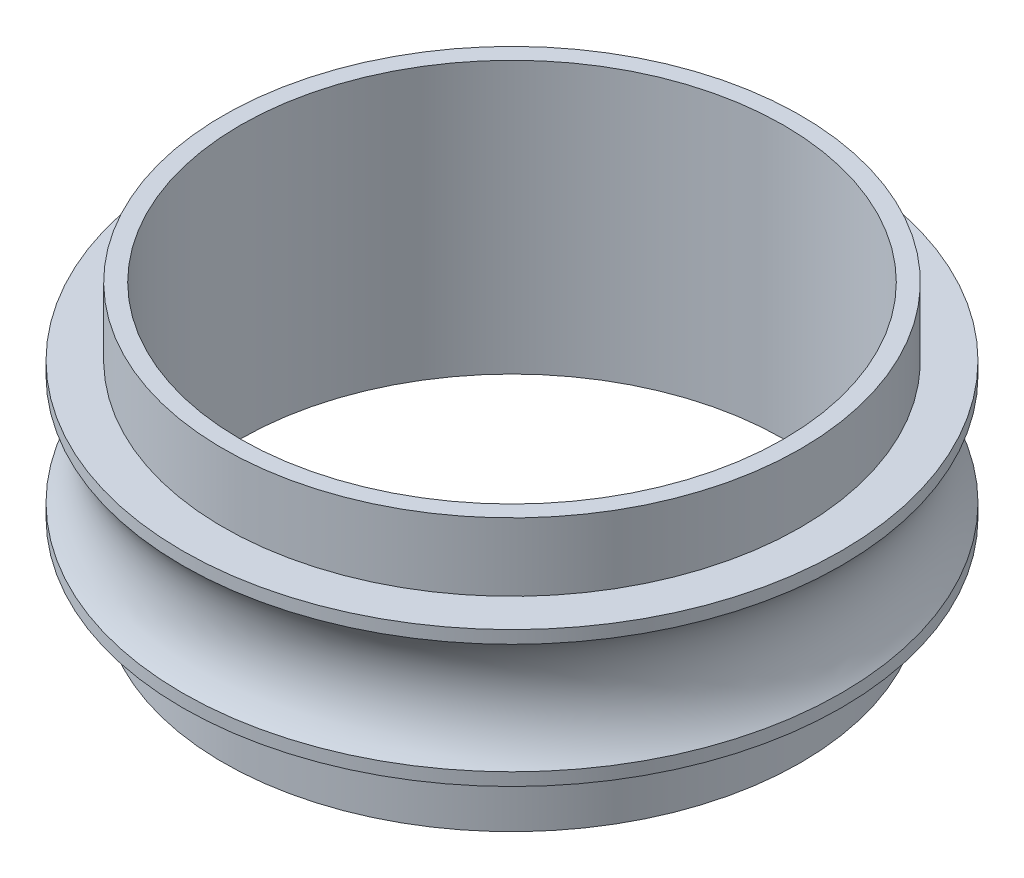
ISO-10303-21;
HEADER;
FILE_DESCRIPTION(('STEP AP214'),'2;1');
FILE_NAME('part.step','',(''),(''),'','','');
FILE_SCHEMA(('AUTOMOTIVE_DESIGN { 1 0 10303 214 1 1 1 1 }'));
ENDSEC;
DATA;
#1=APPLICATION_CONTEXT('core data for automotive mechanical design processes');
#2=APPLICATION_PROTOCOL_DEFINITION('international standard','automotive_design',2000,#1);
#3=PRODUCT_CONTEXT('',#1,'mechanical');
#4=PRODUCT('Part','Part','',(#3));
#5=PRODUCT_RELATED_PRODUCT_CATEGORY('part','',(#4));
#6=PRODUCT_DEFINITION_FORMATION('','',#4);
#7=PRODUCT_DEFINITION_CONTEXT('part definition',#1,'design');
#8=PRODUCT_DEFINITION('design','',#6,#7);
#9=PRODUCT_DEFINITION_SHAPE('','',#8);
#10=(LENGTH_UNIT() NAMED_UNIT(*) SI_UNIT(.MILLI.,.METRE.));
#11=(NAMED_UNIT(*) PLANE_ANGLE_UNIT() SI_UNIT($,.RADIAN.));
#12=(NAMED_UNIT(*) SI_UNIT($,.STERADIAN.) SOLID_ANGLE_UNIT());
#13=UNCERTAINTY_MEASURE_WITH_UNIT(LENGTH_MEASURE(1.E-05),#10,'distance_accuracy_value','');
#14=(GEOMETRIC_REPRESENTATION_CONTEXT(3) GLOBAL_UNCERTAINTY_ASSIGNED_CONTEXT((#13)) GLOBAL_UNIT_ASSIGNED_CONTEXT((#10,
#11,#12)) REPRESENTATION_CONTEXT('',''));
#15=CARTESIAN_POINT('',(0.,0.,0.));
#16=DIRECTION('',(0.,0.,1.));
#17=DIRECTION('',(1.,0.,0.));
#18=AXIS2_PLACEMENT_3D('',#15,#16,#17);
#19=CARTESIAN_POINT('',(11.6,4.4,0.));
#20=DIRECTION('',(0.,-1.,0.));
#21=DIRECTION('',(-1.,0.,0.));
#22=AXIS2_PLACEMENT_3D('',#19,#20,#21);
#23=CYLINDRICAL_SURFACE('',#22,8.5);
#24=CARTESIAN_POINT('',(11.6,2.,0.));
#25=DIRECTION('',(0.,-1.,0.));
#26=DIRECTION('',(-1.,0.,0.));
#27=AXIS2_PLACEMENT_3D('',#24,#25,#26);
#28=CIRCLE('',#27,8.5);
#29=CARTESIAN_POINT('',(20.1,2.,0.));
#30=VERTEX_POINT('',#29);
#31=EDGE_CURVE('E28',#30,#30,#28,.T.);
#32=ORIENTED_EDGE('',*,*,#31,.F.);
#33=DIRECTION('',(0.,1.,0.));
#34=VECTOR('',#33,1.);
#35=CARTESIAN_POINT('',(20.1,4.4,0.));
#36=LINE('',#35,#34);
#37=CARTESIAN_POINT('',(20.1,4.,0.));
#38=VERTEX_POINT('',#37);
#39=EDGE_CURVE('E11',#30,#38,#36,.T.);
#40=ORIENTED_EDGE('',*,*,#39,.T.);
#41=CARTESIAN_POINT('',(11.6,4.,0.));
#42=DIRECTION('',(0.,1.,0.));
#43=DIRECTION('',(-1.,0.,0.));
#44=AXIS2_PLACEMENT_3D('',#41,#42,#43);
#45=CIRCLE('',#44,8.5);
#46=EDGE_CURVE('E140',#38,#38,#45,.T.);
#47=ORIENTED_EDGE('',*,*,#46,.F.);
#48=ORIENTED_EDGE('',*,*,#39,.F.);
#49=EDGE_LOOP('',(#32,#40,#47,#48));
#50=FACE_BOUND('',#49,.T.);
#51=ADVANCED_FACE('F17',(#50),#23,.T.);
#52=CARTESIAN_POINT('',(11.6,2.,0.));
#53=DIRECTION('',(0.,-1.,0.));
#54=DIRECTION('',(0.,0.,-1.));
#55=AXIS2_PLACEMENT_3D('',#52,#53,#54);
#56=PLANE('',#55);
#57=ORIENTED_EDGE('',*,*,#31,.T.);
#58=EDGE_LOOP('',(#57));
#59=FACE_BOUND('',#58,.T.);
#60=CARTESIAN_POINT('',(11.6,2.,0.));
#61=DIRECTION('',(0.,-1.,0.));
#62=DIRECTION('',(-1.,0.,0.));
#63=AXIS2_PLACEMENT_3D('',#60,#61,#62);
#64=CIRCLE('',#63,9.7);
#65=CARTESIAN_POINT('',(21.3,2.,0.));
#66=VERTEX_POINT('',#65);
#67=EDGE_CURVE('E120',#66,#66,#64,.T.);
#68=ORIENTED_EDGE('',*,*,#67,.F.);
#69=EDGE_LOOP('',(#68));
#70=FACE_BOUND('',#69,.T.);
#71=ADVANCED_FACE('F202',(#59,#70),#56,.F.);
#72=CARTESIAN_POINT('',(11.6,4.4,0.));
#73=DIRECTION('',(0.,-1.,0.));
#74=DIRECTION('',(-1.,0.,0.));
#75=AXIS2_PLACEMENT_3D('',#72,#73,#74);
#76=CYLINDRICAL_SURFACE('',#75,9.7);
#77=CARTESIAN_POINT('',(11.6,1.624807680927,0.));
#78=DIRECTION('',(0.,-1.,0.));
#79=DIRECTION('',(-1.,0.,0.));
#80=AXIS2_PLACEMENT_3D('',#77,#78,#79);
#81=CIRCLE('',#80,9.7);
#82=CARTESIAN_POINT('',(21.3,1.624807680927,0.));
#83=VERTEX_POINT('',#82);
#84=EDGE_CURVE('E99',#83,#83,#81,.T.);
#85=ORIENTED_EDGE('',*,*,#84,.F.);
#86=DIRECTION('',(0.,1.,0.));
#87=VECTOR('',#86,1.);
#88=CARTESIAN_POINT('',(21.3,4.4,0.));
#89=LINE('',#88,#87);
#90=EDGE_CURVE('E116',#83,#66,#89,.T.);
#91=ORIENTED_EDGE('',*,*,#90,.T.);
#92=ORIENTED_EDGE('',*,*,#67,.T.);
#93=ORIENTED_EDGE('',*,*,#90,.F.);
#94=EDGE_LOOP('',(#85,#91,#92,#93));
#95=FACE_BOUND('',#94,.T.);
#96=ADVANCED_FACE('F197',(#95),#76,.T.);
#97=CARTESIAN_POINT('',(11.6,0.,0.));
#98=DIRECTION('',(0.,-1.,0.));
#99=DIRECTION('',(-1.,0.,0.));
#100=AXIS2_PLACEMENT_3D('',#97,#98,#99);
#101=TOROIDAL_SURFACE('',#100,11.6,2.5);
#102=CARTESIAN_POINT('',(11.6,-1.624807680927,0.));
#103=DIRECTION('',(0.,-1.,0.));
#104=DIRECTION('',(-1.,0.,0.));
#105=AXIS2_PLACEMENT_3D('',#102,#103,#104);
#106=CIRCLE('',#105,9.7);
#107=CARTESIAN_POINT('',(21.3,-1.624807680927,0.));
#108=VERTEX_POINT('',#107);
#109=EDGE_CURVE('E96',#108,#108,#106,.T.);
#110=ORIENTED_EDGE('',*,*,#109,.F.);
#111=CARTESIAN_POINT('',(23.2,0.,0.));
#112=DIRECTION('',(0.,0.,-1.));
#113=DIRECTION('',(1.,0.,0.));
#114=AXIS2_PLACEMENT_3D('',#111,#112,#113);
#115=CIRCLE('',#114,2.5);
#116=EDGE_CURVE('E93',#108,#83,#115,.T.);
#117=ORIENTED_EDGE('',*,*,#116,.T.);
#118=ORIENTED_EDGE('',*,*,#84,.T.);
#119=ORIENTED_EDGE('',*,*,#116,.F.);
#120=EDGE_LOOP('',(#110,#117,#118,#119));
#121=FACE_BOUND('',#120,.T.);
#122=ADVANCED_FACE('F95',(#121),#101,.F.);
#123=CARTESIAN_POINT('',(11.6,4.4,0.));
#124=DIRECTION('',(0.,-1.,0.));
#125=DIRECTION('',(-1.,0.,0.));
#126=AXIS2_PLACEMENT_3D('',#123,#124,#125);
#127=CYLINDRICAL_SURFACE('',#126,9.7);
#128=CARTESIAN_POINT('',(11.6,-2.,0.));
#129=DIRECTION('',(0.,-1.,0.));
#130=DIRECTION('',(-1.,0.,0.));
#131=AXIS2_PLACEMENT_3D('',#128,#129,#130);
#132=CIRCLE('',#131,9.7);
#133=CARTESIAN_POINT('',(21.3,-2.,0.));
#134=VERTEX_POINT('',#133);
#135=EDGE_CURVE('E21',#134,#134,#132,.T.);
#136=ORIENTED_EDGE('',*,*,#135,.F.);
#137=DIRECTION('',(0.,1.,0.));
#138=VECTOR('',#137,1.);
#139=CARTESIAN_POINT('',(21.3,4.4,0.));
#140=LINE('',#139,#138);
#141=EDGE_CURVE('E105',#134,#108,#140,.T.);
#142=ORIENTED_EDGE('',*,*,#141,.T.);
#143=ORIENTED_EDGE('',*,*,#109,.T.);
#144=ORIENTED_EDGE('',*,*,#141,.F.);
#145=EDGE_LOOP('',(#136,#142,#143,#144));
#146=FACE_BOUND('',#145,.T.);
#147=ADVANCED_FACE('F104',(#146),#127,.T.);
#148=CARTESIAN_POINT('',(11.6,-2.,0.));
#149=DIRECTION('',(0.,-1.,0.));
#150=DIRECTION('',(0.,0.,-1.));
#151=AXIS2_PLACEMENT_3D('',#148,#149,#150);
#152=PLANE('',#151);
#153=CARTESIAN_POINT('',(11.6,-2.,0.));
#154=DIRECTION('',(0.,-1.,0.));
#155=DIRECTION('',(-1.,0.,0.));
#156=AXIS2_PLACEMENT_3D('',#153,#154,#155);
#157=CIRCLE('',#156,8.5);
#158=CARTESIAN_POINT('',(20.1,-2.,0.));
#159=VERTEX_POINT('',#158);
#160=EDGE_CURVE('E121',#159,#159,#157,.T.);
#161=ORIENTED_EDGE('',*,*,#160,.F.);
#162=EDGE_LOOP('',(#161));
#163=FACE_BOUND('',#162,.T.);
#164=ORIENTED_EDGE('',*,*,#135,.T.);
#165=EDGE_LOOP('',(#164));
#166=FACE_BOUND('',#165,.T.);
#167=ADVANCED_FACE('F219',(#163,#166),#152,.T.);
#168=CARTESIAN_POINT('',(11.6,4.4,0.));
#169=DIRECTION('',(0.,-1.,0.));
#170=DIRECTION('',(-1.,0.,0.));
#171=AXIS2_PLACEMENT_3D('',#168,#169,#170);
#172=CYLINDRICAL_SURFACE('',#171,8.5);
#173=CARTESIAN_POINT('',(11.6,-4.,0.));
#174=DIRECTION('',(0.,-1.,0.));
#175=DIRECTION('',(-1.,0.,0.));
#176=AXIS2_PLACEMENT_3D('',#173,#174,#175);
#177=CIRCLE('',#176,8.5);
#178=CARTESIAN_POINT('',(20.1,-4.,0.));
#179=VERTEX_POINT('',#178);
#180=EDGE_CURVE('E125',#179,#179,#177,.T.);
#181=ORIENTED_EDGE('',*,*,#180,.F.);
#182=DIRECTION('',(0.,1.,0.));
#183=VECTOR('',#182,1.);
#184=CARTESIAN_POINT('',(20.1,4.4,0.));
#185=LINE('',#184,#183);
#186=EDGE_CURVE('E58',#179,#159,#185,.T.);
#187=ORIENTED_EDGE('',*,*,#186,.T.);
#188=ORIENTED_EDGE('',*,*,#160,.T.);
#189=ORIENTED_EDGE('',*,*,#186,.F.);
#190=EDGE_LOOP('',(#181,#187,#188,#189));
#191=FACE_BOUND('',#190,.T.);
#192=ADVANCED_FACE('F19',(#191),#172,.T.);
#193=CARTESIAN_POINT('',(11.6,-4.,0.));
#194=DIRECTION('',(0.,-1.,0.));
#195=DIRECTION('',(0.,0.,-1.));
#196=AXIS2_PLACEMENT_3D('',#193,#194,#195);
#197=PLANE('',#196);
#198=CARTESIAN_POINT('',(11.6,-4.,0.));
#199=DIRECTION('',(0.,-1.,0.));
#200=DIRECTION('',(-1.,0.,0.));
#201=AXIS2_PLACEMENT_3D('',#198,#199,#200);
#202=CIRCLE('',#201,8.);
#203=CARTESIAN_POINT('',(19.6,-4.,0.));
#204=VERTEX_POINT('',#203);
#205=EDGE_CURVE('E71',#204,#204,#202,.T.);
#206=ORIENTED_EDGE('',*,*,#205,.F.);
#207=EDGE_LOOP('',(#206));
#208=FACE_BOUND('',#207,.T.);
#209=ORIENTED_EDGE('',*,*,#180,.T.);
#210=EDGE_LOOP('',(#209));
#211=FACE_BOUND('',#210,.T.);
#212=ADVANCED_FACE('F237',(#208,#211),#197,.T.);
#213=CARTESIAN_POINT('',(11.6,4.4,0.));
#214=DIRECTION('',(0.,-1.,0.));
#215=DIRECTION('',(-1.,0.,0.));
#216=AXIS2_PLACEMENT_3D('',#213,#214,#215);
#217=CYLINDRICAL_SURFACE('',#216,8.);
#218=CARTESIAN_POINT('',(11.6,4.,0.));
#219=DIRECTION('',(0.,-1.,0.));
#220=DIRECTION('',(-1.,0.,0.));
#221=AXIS2_PLACEMENT_3D('',#218,#219,#220);
#222=CIRCLE('',#221,8.);
#223=CARTESIAN_POINT('',(19.6,4.,0.));
#224=VERTEX_POINT('',#223);
#225=EDGE_CURVE('E137',#224,#224,#222,.T.);
#226=ORIENTED_EDGE('',*,*,#225,.F.);
#227=DIRECTION('',(0.,-1.,0.));
#228=VECTOR('',#227,1.);
#229=CARTESIAN_POINT('',(19.6,4.4,0.));
#230=LINE('',#229,#228);
#231=EDGE_CURVE('E78',#224,#204,#230,.T.);
#232=ORIENTED_EDGE('',*,*,#231,.T.);
#233=ORIENTED_EDGE('',*,*,#205,.T.);
#234=ORIENTED_EDGE('',*,*,#231,.F.);
#235=EDGE_LOOP('',(#226,#232,#233,#234));
#236=FACE_BOUND('',#235,.T.);
#237=ADVANCED_FACE('F228',(#236),#217,.F.);
#238=CARTESIAN_POINT('',(11.6,4.,0.));
#239=DIRECTION('',(0.,-1.,0.));
#240=DIRECTION('',(0.,0.,-1.));
#241=AXIS2_PLACEMENT_3D('',#238,#239,#240);
#242=PLANE('',#241);
#243=ORIENTED_EDGE('',*,*,#225,.T.);
#244=EDGE_LOOP('',(#243));
#245=FACE_BOUND('',#244,.T.);
#246=ORIENTED_EDGE('',*,*,#46,.T.);
#247=EDGE_LOOP('',(#246));
#248=FACE_BOUND('',#247,.T.);
#249=ADVANCED_FACE('F224',(#245,#248),#242,.F.);
#250=CLOSED_SHELL('',(#51,#71,#96,#122,#147,#167,#192,#212,#237,#249));
#251=MANIFOLD_SOLID_BREP('B1',#250);
#252=ADVANCED_BREP_SHAPE_REPRESENTATION('',(#18,#251),#14);
#253=SHAPE_DEFINITION_REPRESENTATION(#9,#252);
ENDSEC;
END-ISO-10303-21;
